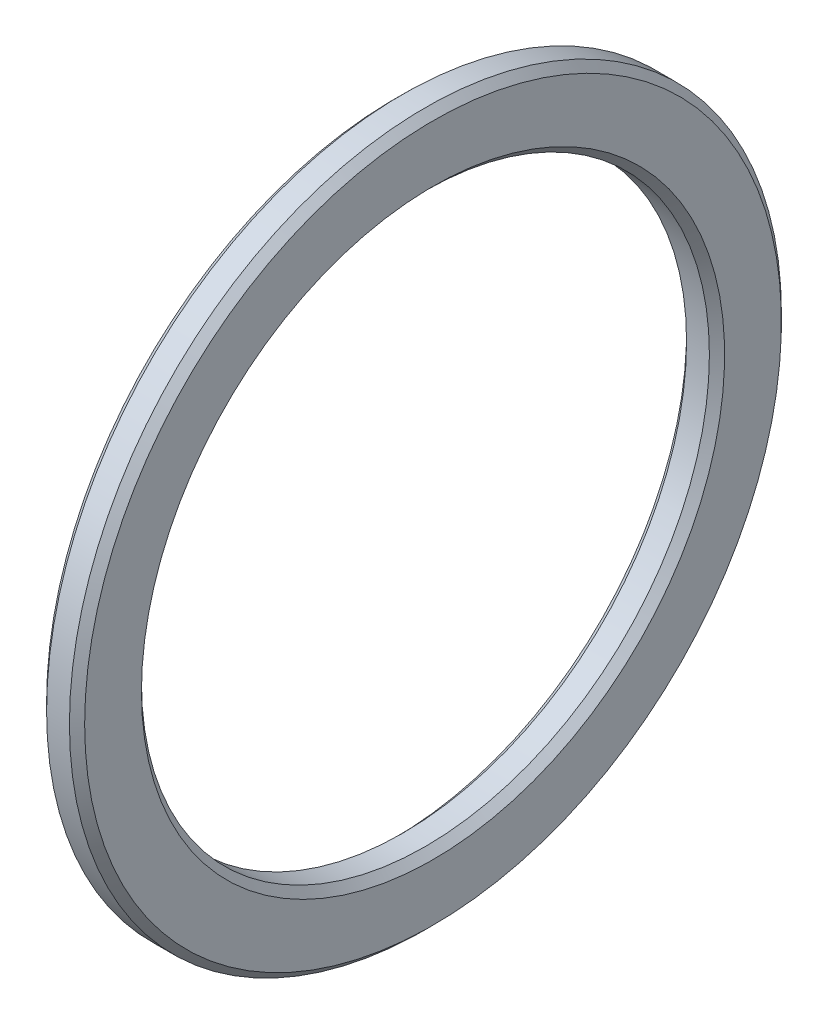
ISO-10303-21;
HEADER;
FILE_DESCRIPTION(('STEP AP214'),'2;1');
FILE_NAME('part.step','',(''),(''),'','','');
FILE_SCHEMA(('AUTOMOTIVE_DESIGN { 1 0 10303 214 1 1 1 1 }'));
ENDSEC;
DATA;
#1=APPLICATION_CONTEXT('core data for automotive mechanical design processes');
#2=APPLICATION_PROTOCOL_DEFINITION('international standard','automotive_design',2000,#1);
#3=PRODUCT_CONTEXT('',#1,'mechanical');
#4=PRODUCT('Part','Part','',(#3));
#5=PRODUCT_RELATED_PRODUCT_CATEGORY('part','',(#4));
#6=PRODUCT_DEFINITION_FORMATION('','',#4);
#7=PRODUCT_DEFINITION_CONTEXT('part definition',#1,'design');
#8=PRODUCT_DEFINITION('design','',#6,#7);
#9=PRODUCT_DEFINITION_SHAPE('','',#8);
#10=(LENGTH_UNIT() NAMED_UNIT(*) SI_UNIT(.MILLI.,.METRE.));
#11=(NAMED_UNIT(*) PLANE_ANGLE_UNIT() SI_UNIT($,.RADIAN.));
#12=(NAMED_UNIT(*) SI_UNIT($,.STERADIAN.) SOLID_ANGLE_UNIT());
#13=UNCERTAINTY_MEASURE_WITH_UNIT(LENGTH_MEASURE(1.E-05),#10,'distance_accuracy_value','');
#14=(GEOMETRIC_REPRESENTATION_CONTEXT(3) GLOBAL_UNCERTAINTY_ASSIGNED_CONTEXT((#13)) GLOBAL_UNIT_ASSIGNED_CONTEXT((#10,
#11,#12)) REPRESENTATION_CONTEXT('',''));
#15=CARTESIAN_POINT('',(0.,0.,0.));
#16=DIRECTION('',(0.,0.,1.));
#17=DIRECTION('',(1.,0.,0.));
#18=AXIS2_PLACEMENT_3D('',#15,#16,#17);
#19=CARTESIAN_POINT('',(-10.6550847457627,0.,0.));
#20=DIRECTION('',(-1.,0.,0.));
#21=DIRECTION('',(0.,0.,1.));
#22=AXIS2_PLACEMENT_3D('',#19,#20,#21);
#23=CYLINDRICAL_SURFACE('',#22,23.38);
#24=CARTESIAN_POINT('',(0.499999999999997,0.,0.));
#25=DIRECTION('',(-1.,0.,0.));
#26=DIRECTION('',(0.,0.,1.));
#27=AXIS2_PLACEMENT_3D('',#24,#25,#26);
#28=CIRCLE('',#27,23.38);
#29=CARTESIAN_POINT('',(0.499999999999997,0.,23.38));
#30=VERTEX_POINT('',#29);
#31=EDGE_CURVE('E58',#30,#30,#28,.T.);
#32=ORIENTED_EDGE('',*,*,#31,.F.);
#33=EDGE_LOOP('',(#32));
#34=FACE_BOUND('',#33,.T.);
#35=CARTESIAN_POINT('',(2.,0.,0.));
#36=DIRECTION('',(-1.,0.,0.));
#37=DIRECTION('',(0.,0.,1.));
#38=AXIS2_PLACEMENT_3D('',#35,#36,#37);
#39=CIRCLE('',#38,23.38);
#40=CARTESIAN_POINT('',(2.,0.,23.38));
#41=VERTEX_POINT('',#40);
#42=EDGE_CURVE('E10',#41,#41,#39,.T.);
#43=ORIENTED_EDGE('',*,*,#42,.T.);
#44=EDGE_LOOP('',(#43));
#45=FACE_BOUND('',#44,.T.);
#46=ADVANCED_FACE('F30',(#34,#45),#23,.T.);
#47=CARTESIAN_POINT('',(2.5,0.,0.));
#48=DIRECTION('',(-1.,0.,0.));
#49=DIRECTION('',(0.,0.,1.));
#50=AXIS2_PLACEMENT_3D('',#47,#48,#49);
#51=CONICAL_SURFACE('',#50,22.88,0.785398163397448);
#52=ORIENTED_EDGE('',*,*,#42,.F.);
#53=EDGE_LOOP('',(#52));
#54=FACE_BOUND('',#53,.T.);
#55=CARTESIAN_POINT('',(2.5,0.,0.));
#56=DIRECTION('',(-1.,0.,0.));
#57=DIRECTION('',(0.,0.,1.));
#58=AXIS2_PLACEMENT_3D('',#55,#56,#57);
#59=CIRCLE('',#58,22.88);
#60=CARTESIAN_POINT('',(2.5,0.,22.88));
#61=VERTEX_POINT('',#60);
#62=EDGE_CURVE('E36',#61,#61,#59,.T.);
#63=ORIENTED_EDGE('',*,*,#62,.T.);
#64=EDGE_LOOP('',(#63));
#65=FACE_BOUND('',#64,.T.);
#66=ADVANCED_FACE('F65',(#54,#65),#51,.T.);
#67=CARTESIAN_POINT('',(2.5,22.88,0.));
#68=DIRECTION('',(-1.,0.,0.));
#69=DIRECTION('',(0.,0.,1.));
#70=AXIS2_PLACEMENT_3D('',#67,#68,#69);
#71=PLANE('',#70);
#72=ORIENTED_EDGE('',*,*,#62,.F.);
#73=EDGE_LOOP('',(#72));
#74=FACE_BOUND('',#73,.T.);
#75=CARTESIAN_POINT('',(2.5,0.,0.));
#76=DIRECTION('',(-1.,0.,0.));
#77=DIRECTION('',(0.,0.,1.));
#78=AXIS2_PLACEMENT_3D('',#75,#76,#77);
#79=CIRCLE('',#78,19.15);
#80=CARTESIAN_POINT('',(2.5,0.,19.15));
#81=VERTEX_POINT('',#80);
#82=EDGE_CURVE('E40',#81,#81,#79,.T.);
#83=ORIENTED_EDGE('',*,*,#82,.T.);
#84=EDGE_LOOP('',(#83));
#85=FACE_BOUND('',#84,.T.);
#86=ADVANCED_FACE('F69',(#74,#85),#71,.F.);
#87=CARTESIAN_POINT('',(2.,0.,0.));
#88=DIRECTION('',(1.,0.,0.));
#89=DIRECTION('',(0.,0.,-1.));
#90=AXIS2_PLACEMENT_3D('',#87,#88,#89);
#91=CONICAL_SURFACE('',#90,18.65,0.785398163397448);
#92=ORIENTED_EDGE('',*,*,#82,.F.);
#93=EDGE_LOOP('',(#92));
#94=FACE_BOUND('',#93,.T.);
#95=CARTESIAN_POINT('',(2.,0.,0.));
#96=DIRECTION('',(-1.,0.,0.));
#97=DIRECTION('',(0.,0.,1.));
#98=AXIS2_PLACEMENT_3D('',#95,#96,#97);
#99=CIRCLE('',#98,18.65);
#100=CARTESIAN_POINT('',(2.,0.,18.65));
#101=VERTEX_POINT('',#100);
#102=EDGE_CURVE('E44',#101,#101,#99,.T.);
#103=ORIENTED_EDGE('',*,*,#102,.T.);
#104=EDGE_LOOP('',(#103));
#105=FACE_BOUND('',#104,.T.);
#106=ADVANCED_FACE('F74',(#94,#105),#91,.F.);
#107=CARTESIAN_POINT('',(-10.6550847457627,0.,0.));
#108=DIRECTION('',(-1.,0.,0.));
#109=DIRECTION('',(0.,0.,1.));
#110=AXIS2_PLACEMENT_3D('',#107,#108,#109);
#111=CYLINDRICAL_SURFACE('',#110,18.65);
#112=ORIENTED_EDGE('',*,*,#102,.F.);
#113=EDGE_LOOP('',(#112));
#114=FACE_BOUND('',#113,.T.);
#115=CARTESIAN_POINT('',(0.5,0.,0.));
#116=DIRECTION('',(-1.,0.,0.));
#117=DIRECTION('',(0.,0.,1.));
#118=AXIS2_PLACEMENT_3D('',#115,#116,#117);
#119=CIRCLE('',#118,18.65);
#120=CARTESIAN_POINT('',(0.5,0.,18.65));
#121=VERTEX_POINT('',#120);
#122=EDGE_CURVE('E49',#121,#121,#119,.T.);
#123=ORIENTED_EDGE('',*,*,#122,.T.);
#124=EDGE_LOOP('',(#123));
#125=FACE_BOUND('',#124,.T.);
#126=ADVANCED_FACE('F80',(#114,#125),#111,.F.);
#127=CARTESIAN_POINT('',(0.,0.,0.));
#128=DIRECTION('',(-1.,0.,0.));
#129=DIRECTION('',(0.,0.,1.));
#130=AXIS2_PLACEMENT_3D('',#127,#128,#129);
#131=CONICAL_SURFACE('',#130,19.15,0.785398163397448);
#132=ORIENTED_EDGE('',*,*,#122,.F.);
#133=EDGE_LOOP('',(#132));
#134=FACE_BOUND('',#133,.T.);
#135=CARTESIAN_POINT('',(0.,0.,0.));
#136=DIRECTION('',(-1.,0.,0.));
#137=DIRECTION('',(0.,0.,1.));
#138=AXIS2_PLACEMENT_3D('',#135,#136,#137);
#139=CIRCLE('',#138,19.15);
#140=CARTESIAN_POINT('',(0.,0.,19.15));
#141=VERTEX_POINT('',#140);
#142=EDGE_CURVE('E52',#141,#141,#139,.T.);
#143=ORIENTED_EDGE('',*,*,#142,.T.);
#144=EDGE_LOOP('',(#143));
#145=FACE_BOUND('',#144,.T.);
#146=ADVANCED_FACE('F84',(#134,#145),#131,.F.);
#147=CARTESIAN_POINT('',(0.,22.88,0.));
#148=DIRECTION('',(1.,0.,0.));
#149=DIRECTION('',(0.,0.,-1.));
#150=AXIS2_PLACEMENT_3D('',#147,#148,#149);
#151=PLANE('',#150);
#152=ORIENTED_EDGE('',*,*,#142,.F.);
#153=EDGE_LOOP('',(#152));
#154=FACE_BOUND('',#153,.T.);
#155=CARTESIAN_POINT('',(0.,0.,0.));
#156=DIRECTION('',(-1.,0.,0.));
#157=DIRECTION('',(0.,0.,1.));
#158=AXIS2_PLACEMENT_3D('',#155,#156,#157);
#159=CIRCLE('',#158,22.88);
#160=CARTESIAN_POINT('',(0.,0.,22.88));
#161=VERTEX_POINT('',#160);
#162=EDGE_CURVE('E55',#161,#161,#159,.T.);
#163=ORIENTED_EDGE('',*,*,#162,.T.);
#164=EDGE_LOOP('',(#163));
#165=FACE_BOUND('',#164,.T.);
#166=ADVANCED_FACE('F88',(#154,#165),#151,.F.);
#167=CARTESIAN_POINT('',(0.499999999999997,0.,0.));
#168=DIRECTION('',(1.,0.,0.));
#169=DIRECTION('',(0.,0.,-1.));
#170=AXIS2_PLACEMENT_3D('',#167,#168,#169);
#171=CONICAL_SURFACE('',#170,23.38,0.78539816339745);
#172=ORIENTED_EDGE('',*,*,#162,.F.);
#173=EDGE_LOOP('',(#172));
#174=FACE_BOUND('',#173,.T.);
#175=ORIENTED_EDGE('',*,*,#31,.T.);
#176=EDGE_LOOP('',(#175));
#177=FACE_BOUND('',#176,.T.);
#178=ADVANCED_FACE('F62',(#174,#177),#171,.T.);
#179=CLOSED_SHELL('',(#46,#66,#86,#106,#126,#146,#166,#178));
#180=MANIFOLD_SOLID_BREP('B2',#179);
#181=ADVANCED_BREP_SHAPE_REPRESENTATION('',(#18,#180),#14);
#182=SHAPE_DEFINITION_REPRESENTATION(#9,#181);
ENDSEC;
END-ISO-10303-21;
